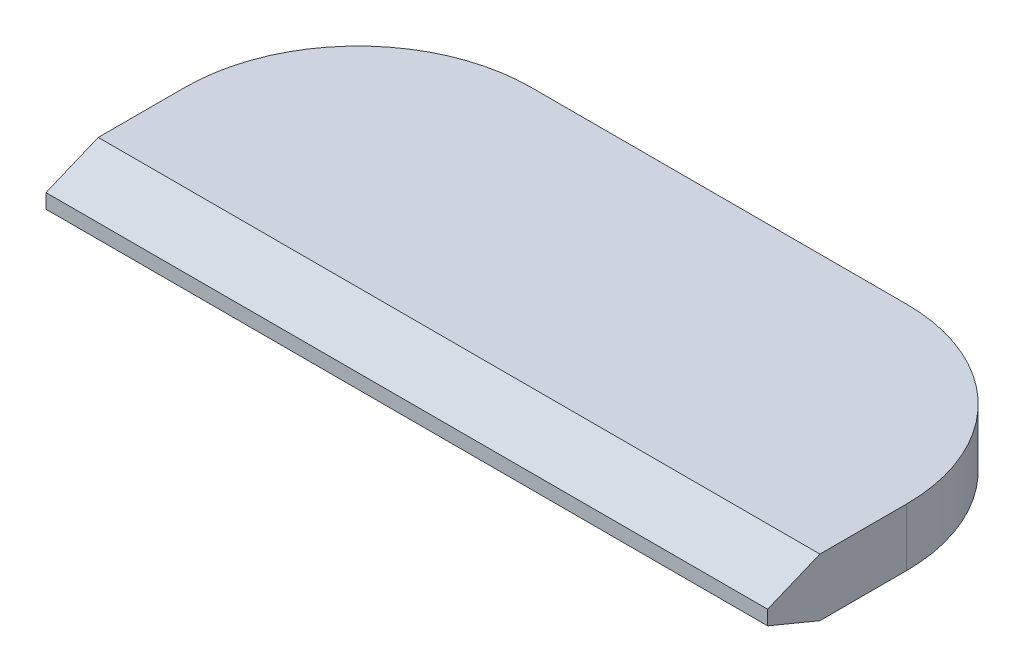
ISO-10303-21;
HEADER;
FILE_DESCRIPTION(('STEP AP214'),'2;1');
FILE_NAME('part.step','',(''),(''),'','','');
FILE_SCHEMA(('AUTOMOTIVE_DESIGN { 1 0 10303 214 1 1 1 1 }'));
ENDSEC;
DATA;
#1=APPLICATION_CONTEXT('core data for automotive mechanical design processes');
#2=APPLICATION_PROTOCOL_DEFINITION('international standard','automotive_design',2000,#1);
#3=PRODUCT_CONTEXT('',#1,'mechanical');
#4=PRODUCT('Part','Part','',(#3));
#5=PRODUCT_RELATED_PRODUCT_CATEGORY('part','',(#4));
#6=PRODUCT_DEFINITION_FORMATION('','',#4);
#7=PRODUCT_DEFINITION_CONTEXT('part definition',#1,'design');
#8=PRODUCT_DEFINITION('design','',#6,#7);
#9=PRODUCT_DEFINITION_SHAPE('','',#8);
#10=(LENGTH_UNIT() NAMED_UNIT(*) SI_UNIT(.MILLI.,.METRE.));
#11=(NAMED_UNIT(*) PLANE_ANGLE_UNIT() SI_UNIT($,.RADIAN.));
#12=(NAMED_UNIT(*) SI_UNIT($,.STERADIAN.) SOLID_ANGLE_UNIT());
#13=UNCERTAINTY_MEASURE_WITH_UNIT(LENGTH_MEASURE(1.E-05),#10,'distance_accuracy_value','');
#14=(GEOMETRIC_REPRESENTATION_CONTEXT(3) GLOBAL_UNCERTAINTY_ASSIGNED_CONTEXT((#13)) GLOBAL_UNIT_ASSIGNED_CONTEXT((#10,
#11,#12)) REPRESENTATION_CONTEXT('',''));
#15=CARTESIAN_POINT('',(0.,0.,0.));
#16=DIRECTION('',(0.,0.,1.));
#17=DIRECTION('',(1.,0.,0.));
#18=AXIS2_PLACEMENT_3D('',#15,#16,#17);
#19=CARTESIAN_POINT('',(0.,2.,0.));
#20=DIRECTION('',(1.,0.,0.));
#21=DIRECTION('',(0.,0.,-1.));
#22=AXIS2_PLACEMENT_3D('',#19,#20,#21);
#23=PLANE('',#22);
#24=DIRECTION('',(0.,0.,1.));
#25=VECTOR('',#24,1.);
#26=CARTESIAN_POINT('',(0.,0.,0.));
#27=LINE('',#26,#25);
#28=CARTESIAN_POINT('',(0.,0.,-4.81066017177982));
#29=VERTEX_POINT('',#28);
#30=CARTESIAN_POINT('',(0.,0.,-1.81066017177982));
#31=VERTEX_POINT('',#30);
#32=EDGE_CURVE('E132',#29,#31,#27,.T.);
#33=ORIENTED_EDGE('',*,*,#32,.T.);
#34=DIRECTION('',(0.,0.382683432365091,0.923879532511287));
#35=VECTOR('',#34,1.);
#36=CARTESIAN_POINT('',(0.,0.750000000000002,0.));
#37=LINE('',#36,#35);
#38=CARTESIAN_POINT('',(0.,0.750000000000002,0.));
#39=VERTEX_POINT('',#38);
#40=EDGE_CURVE('E44',#31,#39,#37,.T.);
#41=ORIENTED_EDGE('',*,*,#40,.T.);
#42=DIRECTION('',(0.,-1.,0.));
#43=VECTOR('',#42,1.);
#44=CARTESIAN_POINT('',(0.,2.,0.));
#45=LINE('',#44,#43);
#46=CARTESIAN_POINT('',(0.,1.25,0.));
#47=VERTEX_POINT('',#46);
#48=EDGE_CURVE('E139',#47,#39,#45,.T.);
#49=ORIENTED_EDGE('',*,*,#48,.F.);
#50=DIRECTION('',(0.,-0.382683432365091,0.923879532511287));
#51=VECTOR('',#50,1.);
#52=CARTESIAN_POINT('',(0.,2.,-1.81066017177982));
#53=LINE('',#52,#51);
#54=CARTESIAN_POINT('',(0.,2.,-1.81066017177982));
#55=VERTEX_POINT('',#54);
#56=EDGE_CURVE('E51',#47,#55,#53,.F.);
#57=ORIENTED_EDGE('',*,*,#56,.T.);
#58=DIRECTION('',(0.,0.,1.));
#59=VECTOR('',#58,1.);
#60=CARTESIAN_POINT('',(0.,2.,0.));
#61=LINE('',#60,#59);
#62=CARTESIAN_POINT('',(0.,2.,-4.81066017177982));
#63=VERTEX_POINT('',#62);
#64=EDGE_CURVE('E127',#63,#55,#61,.T.);
#65=ORIENTED_EDGE('',*,*,#64,.F.);
#66=DIRECTION('',(0.,-1.,0.));
#67=VECTOR('',#66,1.);
#68=CARTESIAN_POINT('',(0.,2.,-4.81066017177982));
#69=LINE('',#68,#67);
#70=EDGE_CURVE('E149',#63,#29,#69,.T.);
#71=ORIENTED_EDGE('',*,*,#70,.T.);
#72=EDGE_LOOP('',(#33,#41,#49,#57,#65,#71));
#73=FACE_BOUND('',#72,.T.);
#74=ADVANCED_FACE('F35',(#73),#23,.F.);
#75=CARTESIAN_POINT('',(0.,2.,0.));
#76=DIRECTION('',(0.,0.,-1.));
#77=DIRECTION('',(-1.,0.,0.));
#78=AXIS2_PLACEMENT_3D('',#75,#76,#77);
#79=PLANE('',#78);
#80=ORIENTED_EDGE('',*,*,#48,.T.);
#81=DIRECTION('',(1.,0.,0.));
#82=VECTOR('',#81,1.);
#83=CARTESIAN_POINT('',(25.,0.750000000000002,0.));
#84=LINE('',#83,#82);
#85=CARTESIAN_POINT('',(25.,0.750000000000002,0.));
#86=VERTEX_POINT('',#85);
#87=EDGE_CURVE('E154',#39,#86,#84,.T.);
#88=ORIENTED_EDGE('',*,*,#87,.T.);
#89=DIRECTION('',(0.,-1.,0.));
#90=VECTOR('',#89,1.);
#91=CARTESIAN_POINT('',(25.,2.,0.));
#92=LINE('',#91,#90);
#93=CARTESIAN_POINT('',(25.,1.25,0.));
#94=VERTEX_POINT('',#93);
#95=EDGE_CURVE('E136',#94,#86,#92,.T.);
#96=ORIENTED_EDGE('',*,*,#95,.F.);
#97=DIRECTION('',(-1.,0.,0.));
#98=VECTOR('',#97,1.);
#99=CARTESIAN_POINT('',(0.,1.25,0.));
#100=LINE('',#99,#98);
#101=EDGE_CURVE('E152',#94,#47,#100,.T.);
#102=ORIENTED_EDGE('',*,*,#101,.T.);
#103=EDGE_LOOP('',(#80,#88,#96,#102));
#104=FACE_BOUND('',#103,.T.);
#105=ADVANCED_FACE('F166',(#104),#79,.F.);
#106=CARTESIAN_POINT('',(25.,2.,0.));
#107=DIRECTION('',(-1.,0.,0.));
#108=DIRECTION('',(0.,0.,1.));
#109=AXIS2_PLACEMENT_3D('',#106,#107,#108);
#110=PLANE('',#109);
#111=ORIENTED_EDGE('',*,*,#95,.T.);
#112=DIRECTION('',(0.,-0.382683432365091,-0.923879532511287));
#113=VECTOR('',#112,1.);
#114=CARTESIAN_POINT('',(25.,0.750000000000002,0.));
#115=LINE('',#114,#113);
#116=CARTESIAN_POINT('',(25.,0.,-1.81066017177982));
#117=VERTEX_POINT('',#116);
#118=EDGE_CURVE('E159',#86,#117,#115,.T.);
#119=ORIENTED_EDGE('',*,*,#118,.T.);
#120=DIRECTION('',(0.,0.,-1.));
#121=VECTOR('',#120,1.);
#122=CARTESIAN_POINT('',(25.,0.,0.));
#123=LINE('',#122,#121);
#124=CARTESIAN_POINT('',(25.,0.,-4.81066017177982));
#125=VERTEX_POINT('',#124);
#126=EDGE_CURVE('E128',#117,#125,#123,.T.);
#127=ORIENTED_EDGE('',*,*,#126,.T.);
#128=DIRECTION('',(0.,-1.,0.));
#129=VECTOR('',#128,1.);
#130=CARTESIAN_POINT('',(25.,2.,-4.81066017177982));
#131=LINE('',#130,#129);
#132=CARTESIAN_POINT('',(25.,2.,-4.81066017177982));
#133=VERTEX_POINT('',#132);
#134=EDGE_CURVE('E112',#125,#133,#131,.F.);
#135=ORIENTED_EDGE('',*,*,#134,.T.);
#136=DIRECTION('',(0.,0.,-1.));
#137=VECTOR('',#136,1.);
#138=CARTESIAN_POINT('',(25.,2.,0.));
#139=LINE('',#138,#137);
#140=CARTESIAN_POINT('',(25.,2.,-1.81066017177982));
#141=VERTEX_POINT('',#140);
#142=EDGE_CURVE('E130',#141,#133,#139,.T.);
#143=ORIENTED_EDGE('',*,*,#142,.F.);
#144=DIRECTION('',(0.,0.382683432365091,-0.923879532511287));
#145=VECTOR('',#144,1.);
#146=CARTESIAN_POINT('',(25.,2.,-1.81066017177982));
#147=LINE('',#146,#145);
#148=EDGE_CURVE('E157',#141,#94,#147,.F.);
#149=ORIENTED_EDGE('',*,*,#148,.T.);
#150=EDGE_LOOP('',(#111,#119,#127,#135,#143,#149));
#151=FACE_BOUND('',#150,.T.);
#152=ADVANCED_FACE('F171',(#151),#110,.F.);
#153=CARTESIAN_POINT('',(0.,2.,-10.8106601717798));
#154=DIRECTION('',(0.,0.,1.));
#155=DIRECTION('',(1.,0.,0.));
#156=AXIS2_PLACEMENT_3D('',#153,#154,#155);
#157=PLANE('',#156);
#158=DIRECTION('',(-1.,0.,0.));
#159=VECTOR('',#158,1.);
#160=CARTESIAN_POINT('',(0.,2.,-10.8106601717798));
#161=LINE('',#160,#159);
#162=CARTESIAN_POINT('',(19.,2.,-10.8106601717798));
#163=VERTEX_POINT('',#162);
#164=CARTESIAN_POINT('',(6.,2.,-10.8106601717798));
#165=VERTEX_POINT('',#164);
#166=EDGE_CURVE('E123',#163,#165,#161,.T.);
#167=ORIENTED_EDGE('',*,*,#166,.F.);
#168=DIRECTION('',(0.,-1.,0.));
#169=VECTOR('',#168,1.);
#170=CARTESIAN_POINT('',(19.,2.,-10.8106601717798));
#171=LINE('',#170,#169);
#172=CARTESIAN_POINT('',(19.,0.,-10.8106601717798));
#173=VERTEX_POINT('',#172);
#174=EDGE_CURVE('E110',#163,#173,#171,.T.);
#175=ORIENTED_EDGE('',*,*,#174,.T.);
#176=DIRECTION('',(-1.,0.,0.));
#177=VECTOR('',#176,1.);
#178=CARTESIAN_POINT('',(0.,0.,-10.8106601717798));
#179=LINE('',#178,#177);
#180=CARTESIAN_POINT('',(6.,0.,-10.8106601717798));
#181=VERTEX_POINT('',#180);
#182=EDGE_CURVE('E120',#173,#181,#179,.T.);
#183=ORIENTED_EDGE('',*,*,#182,.T.);
#184=DIRECTION('',(0.,-1.,0.));
#185=VECTOR('',#184,1.);
#186=CARTESIAN_POINT('',(6.,2.,-10.8106601717798));
#187=LINE('',#186,#185);
#188=EDGE_CURVE('E124',#181,#165,#187,.F.);
#189=ORIENTED_EDGE('',*,*,#188,.T.);
#190=EDGE_LOOP('',(#167,#175,#183,#189));
#191=FACE_BOUND('',#190,.T.);
#192=ADVANCED_FACE('F119',(#191),#157,.F.);
#193=CARTESIAN_POINT('',(0.,2.,0.));
#194=DIRECTION('',(0.,-1.,0.));
#195=DIRECTION('',(0.,0.,-1.));
#196=AXIS2_PLACEMENT_3D('',#193,#194,#195);
#197=PLANE('',#196);
#198=ORIENTED_EDGE('',*,*,#64,.T.);
#199=DIRECTION('',(1.,0.,0.));
#200=VECTOR('',#199,1.);
#201=CARTESIAN_POINT('',(0.,2.,-1.81066017177982));
#202=LINE('',#201,#200);
#203=EDGE_CURVE('E11',#55,#141,#202,.T.);
#204=ORIENTED_EDGE('',*,*,#203,.T.);
#205=ORIENTED_EDGE('',*,*,#142,.T.);
#206=CARTESIAN_POINT('',(19.,2.,-4.81066017177982));
#207=DIRECTION('',(0.,-1.,0.));
#208=DIRECTION('',(0.,0.,-1.));
#209=AXIS2_PLACEMENT_3D('',#206,#207,#208);
#210=CIRCLE('',#209,6.);
#211=EDGE_CURVE('E147',#133,#163,#210,.F.);
#212=ORIENTED_EDGE('',*,*,#211,.T.);
#213=ORIENTED_EDGE('',*,*,#166,.T.);
#214=CARTESIAN_POINT('',(6.,2.,-4.81066017177982));
#215=DIRECTION('',(0.,-1.,0.));
#216=DIRECTION('',(0.,0.,-1.));
#217=AXIS2_PLACEMENT_3D('',#214,#215,#216);
#218=CIRCLE('',#217,6.);
#219=EDGE_CURVE('E145',#165,#63,#218,.F.);
#220=ORIENTED_EDGE('',*,*,#219,.T.);
#221=EDGE_LOOP('',(#198,#204,#205,#212,#213,#220));
#222=FACE_BOUND('',#221,.T.);
#223=ADVANCED_FACE('F176',(#222),#197,.F.);
#224=CARTESIAN_POINT('',(0.,0.,0.));
#225=DIRECTION('',(0.,-1.,0.));
#226=DIRECTION('',(0.,0.,-1.));
#227=AXIS2_PLACEMENT_3D('',#224,#225,#226);
#228=PLANE('',#227);
#229=ORIENTED_EDGE('',*,*,#126,.F.);
#230=DIRECTION('',(-1.,0.,0.));
#231=VECTOR('',#230,1.);
#232=CARTESIAN_POINT('',(0.,0.,-1.81066017177982));
#233=LINE('',#232,#231);
#234=EDGE_CURVE('E59',#117,#31,#233,.T.);
#235=ORIENTED_EDGE('',*,*,#234,.T.);
#236=ORIENTED_EDGE('',*,*,#32,.F.);
#237=CARTESIAN_POINT('',(6.,0.,-4.81066017177982));
#238=DIRECTION('',(0.,-1.,0.));
#239=DIRECTION('',(0.,0.,-1.));
#240=AXIS2_PLACEMENT_3D('',#237,#238,#239);
#241=CIRCLE('',#240,6.);
#242=EDGE_CURVE('E114',#29,#181,#241,.T.);
#243=ORIENTED_EDGE('',*,*,#242,.T.);
#244=ORIENTED_EDGE('',*,*,#182,.F.);
#245=CARTESIAN_POINT('',(19.,0.,-4.81066017177982));
#246=DIRECTION('',(0.,-1.,0.));
#247=DIRECTION('',(0.,0.,-1.));
#248=AXIS2_PLACEMENT_3D('',#245,#246,#247);
#249=CIRCLE('',#248,6.);
#250=EDGE_CURVE('E106',#173,#125,#249,.T.);
#251=ORIENTED_EDGE('',*,*,#250,.T.);
#252=EDGE_LOOP('',(#229,#235,#236,#243,#244,#251));
#253=FACE_BOUND('',#252,.T.);
#254=ADVANCED_FACE('F126',(#253),#228,.T.);
#255=CARTESIAN_POINT('',(19.,2.,-4.81066017177982));
#256=DIRECTION('',(0.,-1.,0.));
#257=DIRECTION('',(0.,0.,-1.));
#258=AXIS2_PLACEMENT_3D('',#255,#256,#257);
#259=CYLINDRICAL_SURFACE('',#258,6.);
#260=ORIENTED_EDGE('',*,*,#211,.F.);
#261=ORIENTED_EDGE('',*,*,#134,.F.);
#262=ORIENTED_EDGE('',*,*,#250,.F.);
#263=ORIENTED_EDGE('',*,*,#174,.F.);
#264=EDGE_LOOP('',(#260,#261,#262,#263));
#265=FACE_BOUND('',#264,.T.);
#266=ADVANCED_FACE('F109',(#265),#259,.T.);
#267=CARTESIAN_POINT('',(6.,2.,-4.81066017177982));
#268=DIRECTION('',(0.,-1.,0.));
#269=DIRECTION('',(0.,0.,-1.));
#270=AXIS2_PLACEMENT_3D('',#267,#268,#269);
#271=CYLINDRICAL_SURFACE('',#270,6.);
#272=ORIENTED_EDGE('',*,*,#219,.F.);
#273=ORIENTED_EDGE('',*,*,#188,.F.);
#274=ORIENTED_EDGE('',*,*,#242,.F.);
#275=ORIENTED_EDGE('',*,*,#70,.F.);
#276=EDGE_LOOP('',(#272,#273,#274,#275));
#277=FACE_BOUND('',#276,.T.);
#278=ADVANCED_FACE('F182',(#277),#271,.T.);
#279=CARTESIAN_POINT('',(0.,0.750000000000002,0.));
#280=DIRECTION('',(0.,-0.923879532511286,0.382683432365091));
#281=DIRECTION('',(-1.,0.,0.));
#282=AXIS2_PLACEMENT_3D('',#279,#280,#281);
#283=PLANE('',#282);
#284=ORIENTED_EDGE('',*,*,#40,.F.);
#285=ORIENTED_EDGE('',*,*,#234,.F.);
#286=ORIENTED_EDGE('',*,*,#118,.F.);
#287=ORIENTED_EDGE('',*,*,#87,.F.);
#288=EDGE_LOOP('',(#284,#285,#286,#287));
#289=FACE_BOUND('',#288,.T.);
#290=ADVANCED_FACE('F169',(#289),#283,.T.);
#291=CARTESIAN_POINT('',(0.,2.,-1.81066017177982));
#292=DIRECTION('',(0.,-0.923879532511286,-0.382683432365091));
#293=DIRECTION('',(1.,0.,0.));
#294=AXIS2_PLACEMENT_3D('',#291,#292,#293);
#295=PLANE('',#294);
#296=ORIENTED_EDGE('',*,*,#56,.F.);
#297=ORIENTED_EDGE('',*,*,#101,.F.);
#298=ORIENTED_EDGE('',*,*,#148,.F.);
#299=ORIENTED_EDGE('',*,*,#203,.F.);
#300=EDGE_LOOP('',(#296,#297,#298,#299));
#301=FACE_BOUND('',#300,.T.);
#302=ADVANCED_FACE('F38',(#301),#295,.F.);
#303=CLOSED_SHELL('',(#74,#105,#152,#192,#223,#254,#266,#278,#290,#302));
#304=MANIFOLD_SOLID_BREP('B2',#303);
#305=ADVANCED_BREP_SHAPE_REPRESENTATION('',(#18,#304),#14);
#306=SHAPE_DEFINITION_REPRESENTATION(#9,#305);
ENDSEC;
END-ISO-10303-21;
